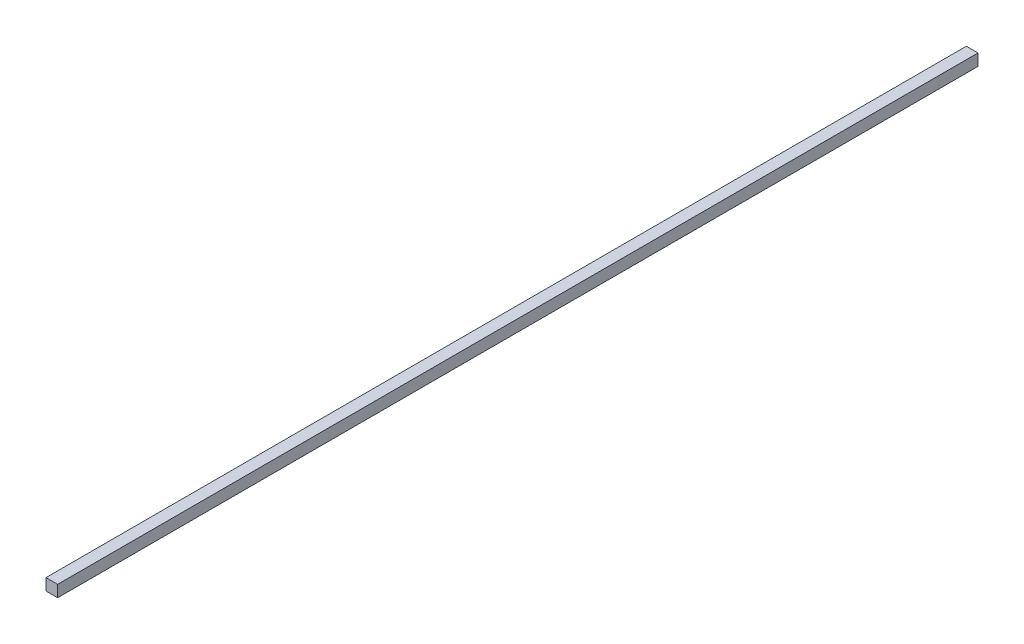
ISO-10303-21;
HEADER;
FILE_DESCRIPTION(('STEP AP214'),'2;1');
FILE_NAME('part.step','',(''),(''),'','','');
FILE_SCHEMA(('AUTOMOTIVE_DESIGN { 1 0 10303 214 1 1 1 1 }'));
ENDSEC;
DATA;
#1=APPLICATION_CONTEXT('core data for automotive mechanical design processes');
#2=APPLICATION_PROTOCOL_DEFINITION('international standard','automotive_design',2000,#1);
#3=PRODUCT_CONTEXT('',#1,'mechanical');
#4=PRODUCT('Part','Part','',(#3));
#5=PRODUCT_RELATED_PRODUCT_CATEGORY('part','',(#4));
#6=PRODUCT_DEFINITION_FORMATION('','',#4);
#7=PRODUCT_DEFINITION_CONTEXT('part definition',#1,'design');
#8=PRODUCT_DEFINITION('design','',#6,#7);
#9=PRODUCT_DEFINITION_SHAPE('','',#8);
#10=(LENGTH_UNIT() NAMED_UNIT(*) SI_UNIT(.MILLI.,.METRE.));
#11=(NAMED_UNIT(*) PLANE_ANGLE_UNIT() SI_UNIT($,.RADIAN.));
#12=(NAMED_UNIT(*) SI_UNIT($,.STERADIAN.) SOLID_ANGLE_UNIT());
#13=UNCERTAINTY_MEASURE_WITH_UNIT(LENGTH_MEASURE(1.E-05),#10,'distance_accuracy_value','');
#14=(GEOMETRIC_REPRESENTATION_CONTEXT(3) GLOBAL_UNCERTAINTY_ASSIGNED_CONTEXT((#13)) GLOBAL_UNIT_ASSIGNED_CONTEXT((#10,
#11,#12)) REPRESENTATION_CONTEXT('',''));
#15=CARTESIAN_POINT('',(0.,0.,0.));
#16=DIRECTION('',(0.,0.,1.));
#17=DIRECTION('',(1.,0.,0.));
#18=AXIS2_PLACEMENT_3D('',#15,#16,#17);
#19=CARTESIAN_POINT('',(-6.53465346534654,4.05940594059406,790.));
#20=DIRECTION('',(1.,0.,0.));
#21=DIRECTION('',(0.,1.,0.));
#22=AXIS2_PLACEMENT_3D('',#19,#20,#21);
#23=PLANE('',#22);
#24=DIRECTION('',(0.,-1.,0.));
#25=VECTOR('',#24,1.);
#26=CARTESIAN_POINT('',(-6.53465346534654,4.05940594059406,0.));
#27=LINE('',#26,#25);
#28=CARTESIAN_POINT('',(-6.53465346534654,4.05940594059406,0.));
#29=VERTEX_POINT('',#28);
#30=CARTESIAN_POINT('',(-6.53465346534654,-5.94059405940594,0.));
#31=VERTEX_POINT('',#30);
#32=EDGE_CURVE('E96',#29,#31,#27,.T.);
#33=ORIENTED_EDGE('',*,*,#32,.T.);
#34=DIRECTION('',(0.,0.,-1.));
#35=VECTOR('',#34,1.);
#36=CARTESIAN_POINT('',(-6.53465346534654,-5.94059405940594,790.));
#37=LINE('',#36,#35);
#38=CARTESIAN_POINT('',(-6.53465346534654,-5.94059405940594,790.));
#39=VERTEX_POINT('',#38);
#40=EDGE_CURVE('E11',#39,#31,#37,.T.);
#41=ORIENTED_EDGE('',*,*,#40,.F.);
#42=DIRECTION('',(0.,-1.,0.));
#43=VECTOR('',#42,1.);
#44=CARTESIAN_POINT('',(-6.53465346534654,4.05940594059406,790.));
#45=LINE('',#44,#43);
#46=CARTESIAN_POINT('',(-6.53465346534654,4.05940594059406,790.));
#47=VERTEX_POINT('',#46);
#48=EDGE_CURVE('E84',#47,#39,#45,.T.);
#49=ORIENTED_EDGE('',*,*,#48,.F.);
#50=DIRECTION('',(0.,0.,-1.));
#51=VECTOR('',#50,1.);
#52=CARTESIAN_POINT('',(-6.53465346534654,4.05940594059406,790.));
#53=LINE('',#52,#51);
#54=EDGE_CURVE('E92',#47,#29,#53,.T.);
#55=ORIENTED_EDGE('',*,*,#54,.T.);
#56=EDGE_LOOP('',(#33,#41,#49,#55));
#57=FACE_BOUND('',#56,.T.);
#58=ADVANCED_FACE('F33',(#57),#23,.F.);
#59=CARTESIAN_POINT('',(-6.53465346534654,-5.94059405940594,790.));
#60=DIRECTION('',(0.,1.,0.));
#61=DIRECTION('',(0.,0.,1.));
#62=AXIS2_PLACEMENT_3D('',#59,#60,#61);
#63=PLANE('',#62);
#64=DIRECTION('',(1.,0.,0.));
#65=VECTOR('',#64,1.);
#66=CARTESIAN_POINT('',(-6.53465346534654,-5.94059405940594,0.));
#67=LINE('',#66,#65);
#68=CARTESIAN_POINT('',(3.46534653465346,-5.94059405940594,0.));
#69=VERTEX_POINT('',#68);
#70=EDGE_CURVE('E88',#31,#69,#67,.T.);
#71=ORIENTED_EDGE('',*,*,#70,.T.);
#72=DIRECTION('',(0.,0.,-1.));
#73=VECTOR('',#72,1.);
#74=CARTESIAN_POINT('',(3.46534653465346,-5.94059405940594,790.));
#75=LINE('',#74,#73);
#76=CARTESIAN_POINT('',(3.46534653465346,-5.94059405940594,790.));
#77=VERTEX_POINT('',#76);
#78=EDGE_CURVE('E41',#77,#69,#75,.T.);
#79=ORIENTED_EDGE('',*,*,#78,.F.);
#80=DIRECTION('',(1.,0.,0.));
#81=VECTOR('',#80,1.);
#82=CARTESIAN_POINT('',(-6.53465346534654,-5.94059405940594,790.));
#83=LINE('',#82,#81);
#84=EDGE_CURVE('E79',#39,#77,#83,.T.);
#85=ORIENTED_EDGE('',*,*,#84,.F.);
#86=ORIENTED_EDGE('',*,*,#40,.T.);
#87=EDGE_LOOP('',(#71,#79,#85,#86));
#88=FACE_BOUND('',#87,.T.);
#89=ADVANCED_FACE('F87',(#88),#63,.F.);
#90=CARTESIAN_POINT('',(3.46534653465346,4.05940594059406,790.));
#91=DIRECTION('',(-1.,0.,0.));
#92=DIRECTION('',(0.,-1.,0.));
#93=AXIS2_PLACEMENT_3D('',#90,#91,#92);
#94=PLANE('',#93);
#95=DIRECTION('',(0.,1.,0.));
#96=VECTOR('',#95,1.);
#97=CARTESIAN_POINT('',(3.46534653465346,4.05940594059406,0.));
#98=LINE('',#97,#96);
#99=CARTESIAN_POINT('',(3.46534653465346,4.05940594059406,0.));
#100=VERTEX_POINT('',#99);
#101=EDGE_CURVE('E66',#69,#100,#98,.T.);
#102=ORIENTED_EDGE('',*,*,#101,.T.);
#103=DIRECTION('',(0.,0.,-1.));
#104=VECTOR('',#103,1.);
#105=CARTESIAN_POINT('',(3.46534653465346,4.05940594059406,790.));
#106=LINE('',#105,#104);
#107=CARTESIAN_POINT('',(3.46534653465346,4.05940594059406,790.));
#108=VERTEX_POINT('',#107);
#109=EDGE_CURVE('E89',#108,#100,#106,.T.);
#110=ORIENTED_EDGE('',*,*,#109,.F.);
#111=DIRECTION('',(0.,1.,0.));
#112=VECTOR('',#111,1.);
#113=CARTESIAN_POINT('',(3.46534653465346,4.05940594059406,790.));
#114=LINE('',#113,#112);
#115=EDGE_CURVE('E82',#77,#108,#114,.T.);
#116=ORIENTED_EDGE('',*,*,#115,.F.);
#117=ORIENTED_EDGE('',*,*,#78,.T.);
#118=EDGE_LOOP('',(#102,#110,#116,#117));
#119=FACE_BOUND('',#118,.T.);
#120=ADVANCED_FACE('F90',(#119),#94,.F.);
#121=CARTESIAN_POINT('',(-6.53465346534654,4.05940594059406,790.));
#122=DIRECTION('',(0.,-1.,0.));
#123=DIRECTION('',(0.,0.,-1.));
#124=AXIS2_PLACEMENT_3D('',#121,#122,#123);
#125=PLANE('',#124);
#126=DIRECTION('',(-1.,0.,0.));
#127=VECTOR('',#126,1.);
#128=CARTESIAN_POINT('',(-6.53465346534654,4.05940594059406,0.));
#129=LINE('',#128,#127);
#130=EDGE_CURVE('E72',#100,#29,#129,.T.);
#131=ORIENTED_EDGE('',*,*,#130,.T.);
#132=ORIENTED_EDGE('',*,*,#54,.F.);
#133=DIRECTION('',(-1.,0.,0.));
#134=VECTOR('',#133,1.);
#135=CARTESIAN_POINT('',(-6.53465346534654,4.05940594059406,790.));
#136=LINE('',#135,#134);
#137=EDGE_CURVE('E49',#108,#47,#136,.T.);
#138=ORIENTED_EDGE('',*,*,#137,.F.);
#139=ORIENTED_EDGE('',*,*,#109,.T.);
#140=EDGE_LOOP('',(#131,#132,#138,#139));
#141=FACE_BOUND('',#140,.T.);
#142=ADVANCED_FACE('F103',(#141),#125,.F.);
#143=CARTESIAN_POINT('',(0.,0.,790.));
#144=DIRECTION('',(0.,0.,1.));
#145=DIRECTION('',(1.,0.,0.));
#146=AXIS2_PLACEMENT_3D('',#143,#144,#145);
#147=PLANE('',#146);
#148=ORIENTED_EDGE('',*,*,#48,.T.);
#149=ORIENTED_EDGE('',*,*,#84,.T.);
#150=ORIENTED_EDGE('',*,*,#115,.T.);
#151=ORIENTED_EDGE('',*,*,#137,.T.);
#152=EDGE_LOOP('',(#148,#149,#150,#151));
#153=FACE_BOUND('',#152,.T.);
#154=ADVANCED_FACE('F80',(#153),#147,.T.);
#155=CARTESIAN_POINT('',(0.,0.,0.));
#156=DIRECTION('',(0.,0.,1.));
#157=DIRECTION('',(1.,0.,0.));
#158=AXIS2_PLACEMENT_3D('',#155,#156,#157);
#159=PLANE('',#158);
#160=ORIENTED_EDGE('',*,*,#32,.F.);
#161=ORIENTED_EDGE('',*,*,#130,.F.);
#162=ORIENTED_EDGE('',*,*,#101,.F.);
#163=ORIENTED_EDGE('',*,*,#70,.F.);
#164=EDGE_LOOP('',(#160,#161,#162,#163));
#165=FACE_BOUND('',#164,.T.);
#166=ADVANCED_FACE('F106',(#165),#159,.F.);
#167=CLOSED_SHELL('',(#58,#89,#120,#142,#154,#166));
#168=MANIFOLD_SOLID_BREP('B2',#167);
#169=ADVANCED_BREP_SHAPE_REPRESENTATION('',(#18,#168),#14);
#170=SHAPE_DEFINITION_REPRESENTATION(#9,#169);
ENDSEC;
END-ISO-10303-21;
